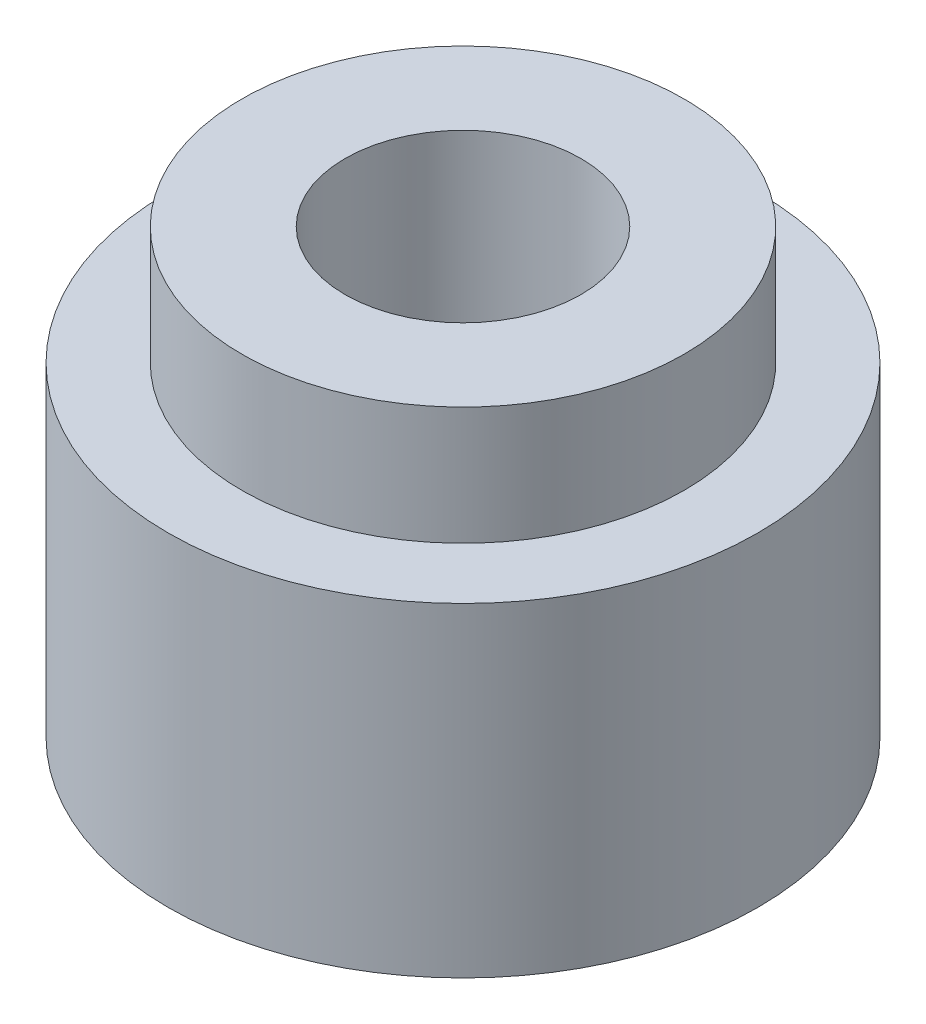
ISO-10303-21;
HEADER;
FILE_DESCRIPTION(('STEP AP214'),'2;1');
FILE_NAME('part.step','',(''),(''),'','','');
FILE_SCHEMA(('AUTOMOTIVE_DESIGN { 1 0 10303 214 1 1 1 1 }'));
ENDSEC;
DATA;
#1=APPLICATION_CONTEXT('core data for automotive mechanical design processes');
#2=APPLICATION_PROTOCOL_DEFINITION('international standard','automotive_design',2000,#1);
#3=PRODUCT_CONTEXT('',#1,'mechanical');
#4=PRODUCT('Part','Part','',(#3));
#5=PRODUCT_RELATED_PRODUCT_CATEGORY('part','',(#4));
#6=PRODUCT_DEFINITION_FORMATION('','',#4);
#7=PRODUCT_DEFINITION_CONTEXT('part definition',#1,'design');
#8=PRODUCT_DEFINITION('design','',#6,#7);
#9=PRODUCT_DEFINITION_SHAPE('','',#8);
#10=(LENGTH_UNIT() NAMED_UNIT(*) SI_UNIT(.MILLI.,.METRE.));
#11=(NAMED_UNIT(*) PLANE_ANGLE_UNIT() SI_UNIT($,.RADIAN.));
#12=(NAMED_UNIT(*) SI_UNIT($,.STERADIAN.) SOLID_ANGLE_UNIT());
#13=UNCERTAINTY_MEASURE_WITH_UNIT(LENGTH_MEASURE(1.E-05),#10,'distance_accuracy_value','');
#14=(GEOMETRIC_REPRESENTATION_CONTEXT(3) GLOBAL_UNCERTAINTY_ASSIGNED_CONTEXT((#13)) GLOBAL_UNIT_ASSIGNED_CONTEXT((#10,
#11,#12)) REPRESENTATION_CONTEXT('',''));
#15=CARTESIAN_POINT('',(0.,0.,0.));
#16=DIRECTION('',(0.,0.,1.));
#17=DIRECTION('',(1.,0.,0.));
#18=AXIS2_PLACEMENT_3D('',#15,#16,#17);
#19=CARTESIAN_POINT('',(3.49148133884313E-12,-1000.,0.));
#20=DIRECTION('',(0.,-1.,0.));
#21=DIRECTION('',(1.,0.,0.));
#22=AXIS2_PLACEMENT_3D('',#19,#20,#21);
#23=CYLINDRICAL_SURFACE('',#22,2.54000000000002);
#24=CARTESIAN_POINT('',(0.,0.,0.));
#25=DIRECTION('',(0.,-1.,0.));
#26=DIRECTION('',(1.,0.,0.));
#27=AXIS2_PLACEMENT_3D('',#24,#25,#26);
#28=CIRCLE('',#27,2.54);
#29=CARTESIAN_POINT('',(2.54,0.,0.));
#30=VERTEX_POINT('',#29);
#31=EDGE_CURVE('E10',#30,#30,#28,.T.);
#32=ORIENTED_EDGE('',*,*,#31,.T.);
#33=EDGE_LOOP('',(#32));
#34=FACE_BOUND('',#33,.T.);
#35=CARTESIAN_POINT('',(0.,9.52500000000001,0.));
#36=DIRECTION('',(0.,-1.,0.));
#37=DIRECTION('',(1.,0.,0.));
#38=AXIS2_PLACEMENT_3D('',#35,#36,#37);
#39=CIRCLE('',#38,2.54000000000003);
#40=CARTESIAN_POINT('',(2.54,9.52500000000001,0.));
#41=VERTEX_POINT('',#40);
#42=EDGE_CURVE('E52',#41,#41,#39,.T.);
#43=ORIENTED_EDGE('',*,*,#42,.F.);
#44=EDGE_LOOP('',(#43));
#45=FACE_BOUND('',#44,.T.);
#46=ADVANCED_FACE('F30',(#34,#45),#23,.F.);
#47=CARTESIAN_POINT('',(2.54,0.,0.));
#48=DIRECTION('',(0.,-1.,0.));
#49=DIRECTION('',(1.,0.,0.));
#50=AXIS2_PLACEMENT_3D('',#47,#48,#49);
#51=PLANE('',#50);
#52=CARTESIAN_POINT('',(0.,0.,0.));
#53=DIRECTION('',(0.,-1.,0.));
#54=DIRECTION('',(1.,0.,0.));
#55=AXIS2_PLACEMENT_3D('',#52,#53,#54);
#56=CIRCLE('',#55,6.35);
#57=CARTESIAN_POINT('',(6.35,0.,0.));
#58=VERTEX_POINT('',#57);
#59=EDGE_CURVE('E36',#58,#58,#56,.T.);
#60=ORIENTED_EDGE('',*,*,#59,.T.);
#61=EDGE_LOOP('',(#60));
#62=FACE_BOUND('',#61,.T.);
#63=ORIENTED_EDGE('',*,*,#31,.F.);
#64=EDGE_LOOP('',(#63));
#65=FACE_BOUND('',#64,.T.);
#66=ADVANCED_FACE('F60',(#62,#65),#51,.T.);
#67=CARTESIAN_POINT('',(3.49148133884313E-12,-1000.,0.));
#68=DIRECTION('',(0.,-1.,0.));
#69=DIRECTION('',(1.,0.,0.));
#70=AXIS2_PLACEMENT_3D('',#67,#68,#69);
#71=CYLINDRICAL_SURFACE('',#70,6.35000000000001);
#72=CARTESIAN_POINT('',(0.,6.98500000000002,0.));
#73=DIRECTION('',(0.,-1.,0.));
#74=DIRECTION('',(1.,0.,0.));
#75=AXIS2_PLACEMENT_3D('',#72,#73,#74);
#76=CIRCLE('',#75,6.35000000000002);
#77=CARTESIAN_POINT('',(6.35,6.98500000000004,0.));
#78=VERTEX_POINT('',#77);
#79=EDGE_CURVE('E40',#78,#78,#76,.T.);
#80=ORIENTED_EDGE('',*,*,#79,.T.);
#81=EDGE_LOOP('',(#80));
#82=FACE_BOUND('',#81,.T.);
#83=ORIENTED_EDGE('',*,*,#59,.F.);
#84=EDGE_LOOP('',(#83));
#85=FACE_BOUND('',#84,.T.);
#86=ADVANCED_FACE('F64',(#82,#85),#71,.T.);
#87=CARTESIAN_POINT('',(6.35,6.985,0.));
#88=DIRECTION('',(0.,1.,0.));
#89=DIRECTION('',(-1.,0.,0.));
#90=AXIS2_PLACEMENT_3D('',#87,#88,#89);
#91=PLANE('',#90);
#92=CARTESIAN_POINT('',(0.,6.98500000000002,0.));
#93=DIRECTION('',(0.,-1.,0.));
#94=DIRECTION('',(1.,0.,0.));
#95=AXIS2_PLACEMENT_3D('',#92,#93,#94);
#96=CIRCLE('',#95,4.76250000000003);
#97=CARTESIAN_POINT('',(4.7625,6.98500000000004,0.));
#98=VERTEX_POINT('',#97);
#99=EDGE_CURVE('E44',#98,#98,#96,.T.);
#100=ORIENTED_EDGE('',*,*,#99,.T.);
#101=EDGE_LOOP('',(#100));
#102=FACE_BOUND('',#101,.T.);
#103=ORIENTED_EDGE('',*,*,#79,.F.);
#104=EDGE_LOOP('',(#103));
#105=FACE_BOUND('',#104,.T.);
#106=ADVANCED_FACE('F68',(#102,#105),#91,.T.);
#107=CARTESIAN_POINT('',(3.49148133884313E-12,-1000.,0.));
#108=DIRECTION('',(0.,-1.,0.));
#109=DIRECTION('',(1.,0.,0.));
#110=AXIS2_PLACEMENT_3D('',#107,#108,#109);
#111=CYLINDRICAL_SURFACE('',#110,4.76250000000003);
#112=CARTESIAN_POINT('',(0.,9.52500000000001,0.));
#113=DIRECTION('',(0.,-1.,0.));
#114=DIRECTION('',(1.,0.,0.));
#115=AXIS2_PLACEMENT_3D('',#112,#113,#114);
#116=CIRCLE('',#115,4.76250000000003);
#117=CARTESIAN_POINT('',(4.7625,9.52500000000002,0.));
#118=VERTEX_POINT('',#117);
#119=EDGE_CURVE('E49',#118,#118,#116,.T.);
#120=ORIENTED_EDGE('',*,*,#119,.T.);
#121=EDGE_LOOP('',(#120));
#122=FACE_BOUND('',#121,.T.);
#123=ORIENTED_EDGE('',*,*,#99,.F.);
#124=EDGE_LOOP('',(#123));
#125=FACE_BOUND('',#124,.T.);
#126=ADVANCED_FACE('F75',(#122,#125),#111,.T.);
#127=CARTESIAN_POINT('',(4.7625,9.525,0.));
#128=DIRECTION('',(0.,1.,0.));
#129=DIRECTION('',(-1.,0.,0.));
#130=AXIS2_PLACEMENT_3D('',#127,#128,#129);
#131=PLANE('',#130);
#132=ORIENTED_EDGE('',*,*,#42,.T.);
#133=EDGE_LOOP('',(#132));
#134=FACE_BOUND('',#133,.T.);
#135=ORIENTED_EDGE('',*,*,#119,.F.);
#136=EDGE_LOOP('',(#135));
#137=FACE_BOUND('',#136,.T.);
#138=ADVANCED_FACE('F56',(#134,#137),#131,.T.);
#139=CLOSED_SHELL('',(#46,#66,#86,#106,#126,#138));
#140=MANIFOLD_SOLID_BREP('B2',#139);
#141=ADVANCED_BREP_SHAPE_REPRESENTATION('',(#18,#140),#14);
#142=SHAPE_DEFINITION_REPRESENTATION(#9,#141);
ENDSEC;
END-ISO-10303-21;
